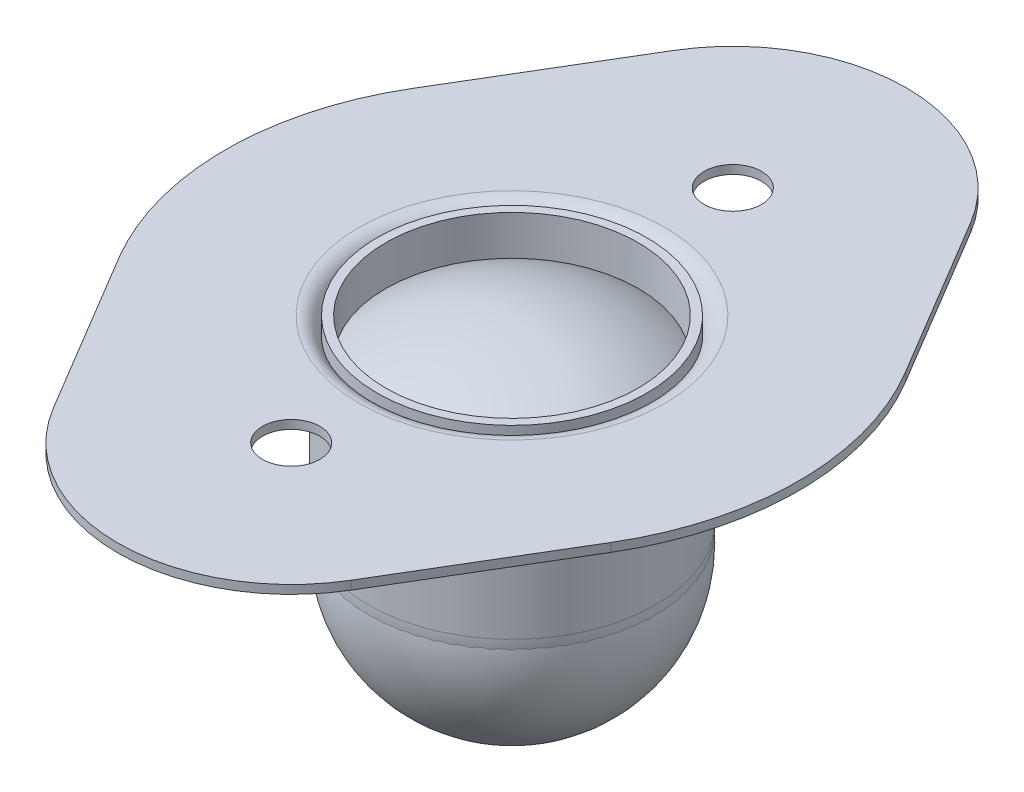
ISO-10303-21;
HEADER;
FILE_DESCRIPTION(('STEP AP214'),'2;1');
FILE_NAME('part.step','',(''),(''),'','','');
FILE_SCHEMA(('AUTOMOTIVE_DESIGN { 1 0 10303 214 1 1 1 1 }'));
ENDSEC;
DATA;
#1=APPLICATION_CONTEXT('core data for automotive mechanical design processes');
#2=APPLICATION_PROTOCOL_DEFINITION('international standard','automotive_design',2000,#1);
#3=PRODUCT_CONTEXT('',#1,'mechanical');
#4=PRODUCT('Part','Part','',(#3));
#5=PRODUCT_RELATED_PRODUCT_CATEGORY('part','',(#4));
#6=PRODUCT_DEFINITION_FORMATION('','',#4);
#7=PRODUCT_DEFINITION_CONTEXT('part definition',#1,'design');
#8=PRODUCT_DEFINITION('design','',#6,#7);
#9=PRODUCT_DEFINITION_SHAPE('','',#8);
#10=(LENGTH_UNIT() NAMED_UNIT(*) SI_UNIT(.MILLI.,.METRE.));
#11=(NAMED_UNIT(*) PLANE_ANGLE_UNIT() SI_UNIT($,.RADIAN.));
#12=(NAMED_UNIT(*) SI_UNIT($,.STERADIAN.) SOLID_ANGLE_UNIT());
#13=UNCERTAINTY_MEASURE_WITH_UNIT(LENGTH_MEASURE(1.E-05),#10,'distance_accuracy_value','');
#14=(GEOMETRIC_REPRESENTATION_CONTEXT(3) GLOBAL_UNCERTAINTY_ASSIGNED_CONTEXT((#13)) GLOBAL_UNIT_ASSIGNED_CONTEXT((#10,
#11,#12)) REPRESENTATION_CONTEXT('',''));
#15=CARTESIAN_POINT('',(0.,0.,0.));
#16=DIRECTION('',(0.,0.,1.));
#17=DIRECTION('',(1.,0.,0.));
#18=AXIS2_PLACEMENT_3D('',#15,#16,#17);
#19=CARTESIAN_POINT('',(0.,-16.7005,0.));
#20=DIRECTION('',(0.,-1.,0.));
#21=DIRECTION('',(0.,0.,1.));
#22=AXIS2_PLACEMENT_3D('',#19,#20,#21);
#23=SPHERICAL_SURFACE('',#22,12.7);
#24=CARTESIAN_POINT('',(0.,-29.4005,0.));
#25=VERTEX_POINT('',#24);
#26=VERTEX_LOOP('',#25);
#27=FACE_BOUND('',#26,.T.);
#28=ADVANCED_FACE('F40',(#27),#23,.T.);
#29=CLOSED_SHELL('',(#28));
#30=MANIFOLD_SOLID_BREP('B2',#29);
#31=CARTESIAN_POINT('',(0.,-11.938,0.));
#32=DIRECTION('',(0.,1.,0.));
#33=DIRECTION('',(0.,0.,1.));
#34=AXIS2_PLACEMENT_3D('',#31,#32,#33);
#35=CYLINDRICAL_SURFACE('',#34,11.938);
#36=CARTESIAN_POINT('',(0.,0.762,0.));
#37=DIRECTION('',(0.,1.,0.));
#38=DIRECTION('',(0.,0.,1.));
#39=AXIS2_PLACEMENT_3D('',#36,#37,#38);
#40=CIRCLE('',#39,11.938);
#41=CARTESIAN_POINT('',(0.,0.762,11.938));
#42=VERTEX_POINT('',#41);
#43=EDGE_CURVE('E39',#42,#42,#40,.T.);
#44=ORIENTED_EDGE('',*,*,#43,.F.);
#45=EDGE_LOOP('',(#44));
#46=FACE_BOUND('',#45,.T.);
#47=CARTESIAN_POINT('',(0.,-4.2942942560671,0.));
#48=DIRECTION('',(0.,-1.,0.));
#49=DIRECTION('',(0.,0.,-1.));
#50=AXIS2_PLACEMENT_3D('',#47,#48,#49);
#51=CIRCLE('',#50,11.938);
#52=CARTESIAN_POINT('',(0.,-4.2942942560671,-11.938));
#53=VERTEX_POINT('',#52);
#54=EDGE_CURVE('E66',#53,#53,#51,.F.);
#55=ORIENTED_EDGE('',*,*,#54,.T.);
#56=EDGE_LOOP('',(#55));
#57=FACE_BOUND('',#56,.T.);
#58=ADVANCED_FACE('F63',(#46,#57),#35,.T.);
#59=CARTESIAN_POINT('',(0.,0.762,0.));
#60=DIRECTION('',(0.,1.,0.));
#61=DIRECTION('',(0.,0.,1.));
#62=AXIS2_PLACEMENT_3D('',#59,#60,#61);
#63=PLANE('',#62);
#64=CARTESIAN_POINT('',(0.,0.762000000000001,0.));
#65=DIRECTION('',(0.,1.,0.));
#66=DIRECTION('',(0.,0.,1.));
#67=AXIS2_PLACEMENT_3D('',#64,#65,#66);
#68=CIRCLE('',#67,11.176);
#69=CARTESIAN_POINT('',(0.,0.762000000000001,11.176));
#70=VERTEX_POINT('',#69);
#71=EDGE_CURVE('E73',#70,#70,#68,.T.);
#72=ORIENTED_EDGE('',*,*,#71,.F.);
#73=EDGE_LOOP('',(#72));
#74=FACE_BOUND('',#73,.T.);
#75=ORIENTED_EDGE('',*,*,#43,.T.);
#76=EDGE_LOOP('',(#75));
#77=FACE_BOUND('',#76,.T.);
#78=ADVANCED_FACE('F93',(#74,#77),#63,.T.);
#79=CARTESIAN_POINT('',(0.,-18.7407752659574,0.));
#80=DIRECTION('',(0.,-1.,0.));
#81=DIRECTION('',(0.,0.,1.));
#82=AXIS2_PLACEMENT_3D('',#79,#80,#81);
#83=SPHERICAL_SURFACE('',#82,18.7407752659574);
#84=ORIENTED_EDGE('',*,*,#54,.F.);
#85=EDGE_LOOP('',(#84));
#86=FACE_BOUND('',#85,.T.);
#87=ADVANCED_FACE('F85',(#86),#83,.F.);
#88=CARTESIAN_POINT('',(0.,-11.938,0.));
#89=DIRECTION('',(0.,1.,0.));
#90=DIRECTION('',(0.,0.,1.));
#91=AXIS2_PLACEMENT_3D('',#88,#89,#90);
#92=CYLINDRICAL_SURFACE('',#91,11.176);
#93=ORIENTED_EDGE('',*,*,#71,.T.);
#94=EDGE_LOOP('',(#93));
#95=FACE_BOUND('',#94,.T.);
#96=CARTESIAN_POINT('',(0.,-2.75780723513033,0.));
#97=DIRECTION('',(0.,-1.,0.));
#98=DIRECTION('',(0.,0.,-1.));
#99=AXIS2_PLACEMENT_3D('',#96,#97,#98);
#100=CIRCLE('',#99,11.176);
#101=CARTESIAN_POINT('',(0.,-2.75780723513033,-11.176));
#102=VERTEX_POINT('',#101);
#103=EDGE_CURVE('E77',#102,#102,#100,.F.);
#104=ORIENTED_EDGE('',*,*,#103,.F.);
#105=EDGE_LOOP('',(#104));
#106=FACE_BOUND('',#105,.T.);
#107=ADVANCED_FACE('F83',(#95,#106),#92,.F.);
#108=CARTESIAN_POINT('',(0.,-18.7407752659574,0.));
#109=DIRECTION('',(0.,-1.,0.));
#110=DIRECTION('',(0.,0.,1.));
#111=AXIS2_PLACEMENT_3D('',#108,#109,#110);
#112=SPHERICAL_SURFACE('',#111,19.5027752659574);
#113=ORIENTED_EDGE('',*,*,#103,.T.);
#114=EDGE_LOOP('',(#113));
#115=FACE_BOUND('',#114,.T.);
#116=ADVANCED_FACE('F81',(#115),#112,.T.);
#117=CLOSED_SHELL('',(#58,#78,#87,#107,#116));
#118=MANIFOLD_SOLID_BREP('B6',#117);
#119=CARTESIAN_POINT('',(0.,0.762,0.));
#120=DIRECTION('',(0.,1.,0.));
#121=DIRECTION('',(0.,0.,1.));
#122=AXIS2_PLACEMENT_3D('',#119,#120,#121);
#123=PLANE('',#122);
#124=CARTESIAN_POINT('',(0.,0.762,0.));
#125=DIRECTION('',(0.,1.,0.));
#126=DIRECTION('',(0.,0.,1.));
#127=AXIS2_PLACEMENT_3D('',#124,#125,#126);
#128=CIRCLE('',#127,13.5255);
#129=CARTESIAN_POINT('',(0.,0.762,13.5255));
#130=VERTEX_POINT('',#129);
#131=EDGE_CURVE('E144',#130,#130,#128,.F.);
#132=ORIENTED_EDGE('',*,*,#131,.T.);
#133=EDGE_LOOP('',(#132));
#134=FACE_BOUND('',#133,.T.);
#135=CARTESIAN_POINT('',(0.,0.762,-19.558));
#136=DIRECTION('',(0.,1.,0.));
#137=DIRECTION('',(0.,0.,1.));
#138=AXIS2_PLACEMENT_3D('',#135,#136,#137);
#139=CIRCLE('',#138,2.54);
#140=CARTESIAN_POINT('',(0.,0.762,-22.098));
#141=VERTEX_POINT('',#140);
#142=EDGE_CURVE('E237',#141,#141,#139,.T.);
#143=ORIENTED_EDGE('',*,*,#142,.F.);
#144=EDGE_LOOP('',(#143));
#145=FACE_BOUND('',#144,.T.);
#146=CARTESIAN_POINT('',(0.,0.762,0.));
#147=DIRECTION('',(0.,1.,0.));
#148=DIRECTION('',(0.,0.,1.));
#149=AXIS2_PLACEMENT_3D('',#146,#147,#148);
#150=CIRCLE('',#149,25.4);
#151=CARTESIAN_POINT('',(21.8032677458843,0.762,13.0298701298701));
#152=VERTEX_POINT('',#151);
#153=CARTESIAN_POINT('',(21.8032677458843,0.762,-13.0298701298701));
#154=VERTEX_POINT('',#153);
#155=EDGE_CURVE('E248',#152,#154,#150,.T.);
#156=ORIENTED_EDGE('',*,*,#155,.T.);
#157=DIRECTION('',(-0.512987012987013,0.,-0.8583963679482));
#158=VECTOR('',#157,1.);
#159=CARTESIAN_POINT('',(21.8032677458843,0.762,-13.0298701298701));
#160=LINE('',#159,#158);
#161=CARTESIAN_POINT('',(13.19097698626,0.762,-27.4410714285714));
#162=VERTEX_POINT('',#161);
#163=EDGE_CURVE('E196',#154,#162,#160,.T.);
#164=ORIENTED_EDGE('',*,*,#163,.T.);
#165=CARTESIAN_POINT('',(0.,0.762,-19.558));
#166=DIRECTION('',(0.,1.,0.));
#167=DIRECTION('',(0.,0.,1.));
#168=AXIS2_PLACEMENT_3D('',#165,#166,#167);
#169=CIRCLE('',#168,15.367);
#170=CARTESIAN_POINT('',(-13.19097698626,0.762,-27.4410714285714));
#171=VERTEX_POINT('',#170);
#172=EDGE_CURVE('E368',#162,#171,#169,.T.);
#173=ORIENTED_EDGE('',*,*,#172,.T.);
#174=DIRECTION('',(-0.512987012987012,0.,0.858396367948201));
#175=VECTOR('',#174,1.);
#176=CARTESIAN_POINT('',(-13.19097698626,0.762,-27.4410714285714));
#177=LINE('',#176,#175);
#178=CARTESIAN_POINT('',(-21.8032677458843,0.762,-13.0298701298701));
#179=VERTEX_POINT('',#178);
#180=EDGE_CURVE('E370',#171,#179,#177,.T.);
#181=ORIENTED_EDGE('',*,*,#180,.T.);
#182=CARTESIAN_POINT('',(0.,0.762,0.));
#183=DIRECTION('',(0.,1.,0.));
#184=DIRECTION('',(0.,0.,1.));
#185=AXIS2_PLACEMENT_3D('',#182,#183,#184);
#186=CIRCLE('',#185,25.4);
#187=CARTESIAN_POINT('',(-21.8032677458843,0.762,13.0298701298701));
#188=VERTEX_POINT('',#187);
#189=EDGE_CURVE('E215',#179,#188,#186,.T.);
#190=ORIENTED_EDGE('',*,*,#189,.T.);
#191=DIRECTION('',(0.512987012987013,0.,0.8583963679482));
#192=VECTOR('',#191,1.);
#193=CARTESIAN_POINT('',(-13.19097698626,0.762,27.4410714285714));
#194=LINE('',#193,#192);
#195=CARTESIAN_POINT('',(-13.19097698626,0.762,27.4410714285714));
#196=VERTEX_POINT('',#195);
#197=EDGE_CURVE('E209',#188,#196,#194,.T.);
#198=ORIENTED_EDGE('',*,*,#197,.T.);
#199=CARTESIAN_POINT('',(0.,0.762,19.558));
#200=DIRECTION('',(0.,1.,0.));
#201=DIRECTION('',(0.,0.,1.));
#202=AXIS2_PLACEMENT_3D('',#199,#200,#201);
#203=CIRCLE('',#202,15.367);
#204=CARTESIAN_POINT('',(13.19097698626,0.762,27.4410714285714));
#205=VERTEX_POINT('',#204);
#206=EDGE_CURVE('E213',#196,#205,#203,.T.);
#207=ORIENTED_EDGE('',*,*,#206,.T.);
#208=DIRECTION('',(0.512987012987013,0.,-0.8583963679482));
#209=VECTOR('',#208,1.);
#210=CARTESIAN_POINT('',(21.8032677458843,0.762,13.0298701298701));
#211=LINE('',#210,#209);
#212=EDGE_CURVE('E152',#205,#152,#211,.T.);
#213=ORIENTED_EDGE('',*,*,#212,.T.);
#214=EDGE_LOOP('',(#156,#164,#173,#181,#190,#198,#207,#213));
#215=FACE_BOUND('',#214,.T.);
#216=CARTESIAN_POINT('',(0.,0.762,19.558));
#217=DIRECTION('',(0.,1.,0.));
#218=DIRECTION('',(0.,0.,1.));
#219=AXIS2_PLACEMENT_3D('',#216,#217,#218);
#220=CIRCLE('',#219,2.54);
#221=CARTESIAN_POINT('',(0.,0.762,17.018));
#222=VERTEX_POINT('',#221);
#223=EDGE_CURVE('E356',#222,#222,#220,.T.);
#224=ORIENTED_EDGE('',*,*,#223,.F.);
#225=EDGE_LOOP('',(#224));
#226=FACE_BOUND('',#225,.T.);
#227=ADVANCED_FACE('F135',(#134,#145,#215,#226),#123,.T.);
#228=CARTESIAN_POINT('',(0.,0.,0.));
#229=DIRECTION('',(0.,1.,0.));
#230=DIRECTION('',(0.,0.,1.));
#231=AXIS2_PLACEMENT_3D('',#228,#229,#230);
#232=PLANE('',#231);
#233=CARTESIAN_POINT('',(0.,0.,0.));
#234=DIRECTION('',(0.,1.,0.));
#235=DIRECTION('',(0.,0.,1.));
#236=AXIS2_PLACEMENT_3D('',#233,#234,#235);
#237=CIRCLE('',#236,14.2875);
#238=CARTESIAN_POINT('',(0.,0.,14.2875));
#239=VERTEX_POINT('',#238);
#240=EDGE_CURVE('E269',#239,#239,#237,.T.);
#241=ORIENTED_EDGE('',*,*,#240,.T.);
#242=EDGE_LOOP('',(#241));
#243=FACE_BOUND('',#242,.T.);
#244=CARTESIAN_POINT('',(0.,0.,0.));
#245=DIRECTION('',(0.,1.,0.));
#246=DIRECTION('',(0.,0.,1.));
#247=AXIS2_PLACEMENT_3D('',#244,#245,#246);
#248=CIRCLE('',#247,25.4);
#249=CARTESIAN_POINT('',(21.8032677458843,0.,13.0298701298701));
#250=VERTEX_POINT('',#249);
#251=CARTESIAN_POINT('',(21.8032677458843,0.,-13.0298701298701));
#252=VERTEX_POINT('',#251);
#253=EDGE_CURVE('E233',#250,#252,#248,.T.);
#254=ORIENTED_EDGE('',*,*,#253,.F.);
#255=DIRECTION('',(0.512987012987013,0.,-0.8583963679482));
#256=VECTOR('',#255,1.);
#257=CARTESIAN_POINT('',(21.8032677458843,0.,13.0298701298701));
#258=LINE('',#257,#256);
#259=CARTESIAN_POINT('',(13.19097698626,0.,27.4410714285714));
#260=VERTEX_POINT('',#259);
#261=EDGE_CURVE('E187',#260,#250,#258,.T.);
#262=ORIENTED_EDGE('',*,*,#261,.F.);
#263=CARTESIAN_POINT('',(0.,0.,19.558));
#264=DIRECTION('',(0.,1.,0.));
#265=DIRECTION('',(0.,0.,1.));
#266=AXIS2_PLACEMENT_3D('',#263,#264,#265);
#267=CIRCLE('',#266,15.367);
#268=CARTESIAN_POINT('',(-13.19097698626,0.,27.4410714285714));
#269=VERTEX_POINT('',#268);
#270=EDGE_CURVE('E181',#269,#260,#267,.T.);
#271=ORIENTED_EDGE('',*,*,#270,.F.);
#272=DIRECTION('',(0.512987012987013,0.,0.8583963679482));
#273=VECTOR('',#272,1.);
#274=CARTESIAN_POINT('',(-13.19097698626,0.,27.4410714285714));
#275=LINE('',#274,#273);
#276=CARTESIAN_POINT('',(-21.8032677458843,0.,13.0298701298701));
#277=VERTEX_POINT('',#276);
#278=EDGE_CURVE('E223',#277,#269,#275,.T.);
#279=ORIENTED_EDGE('',*,*,#278,.F.);
#280=CARTESIAN_POINT('',(0.,0.,0.));
#281=DIRECTION('',(0.,1.,0.));
#282=DIRECTION('',(0.,0.,1.));
#283=AXIS2_PLACEMENT_3D('',#280,#281,#282);
#284=CIRCLE('',#283,25.4);
#285=CARTESIAN_POINT('',(-21.8032677458843,0.,-13.0298701298701));
#286=VERTEX_POINT('',#285);
#287=EDGE_CURVE('E243',#286,#277,#284,.T.);
#288=ORIENTED_EDGE('',*,*,#287,.F.);
#289=DIRECTION('',(-0.512987012987012,0.,0.858396367948201));
#290=VECTOR('',#289,1.);
#291=CARTESIAN_POINT('',(-13.19097698626,0.,-27.4410714285714));
#292=LINE('',#291,#290);
#293=CARTESIAN_POINT('',(-13.19097698626,0.,-27.4410714285714));
#294=VERTEX_POINT('',#293);
#295=EDGE_CURVE('E241',#294,#286,#292,.T.);
#296=ORIENTED_EDGE('',*,*,#295,.F.);
#297=CARTESIAN_POINT('',(0.,0.,-19.558));
#298=DIRECTION('',(0.,1.,0.));
#299=DIRECTION('',(0.,0.,1.));
#300=AXIS2_PLACEMENT_3D('',#297,#298,#299);
#301=CIRCLE('',#300,15.367);
#302=CARTESIAN_POINT('',(13.19097698626,0.,-27.4410714285714));
#303=VERTEX_POINT('',#302);
#304=EDGE_CURVE('E239',#303,#294,#301,.T.);
#305=ORIENTED_EDGE('',*,*,#304,.F.);
#306=DIRECTION('',(-0.512987012987013,0.,-0.8583963679482));
#307=VECTOR('',#306,1.);
#308=CARTESIAN_POINT('',(21.8032677458843,0.,-13.0298701298701));
#309=LINE('',#308,#307);
#310=EDGE_CURVE('E236',#252,#303,#309,.T.);
#311=ORIENTED_EDGE('',*,*,#310,.F.);
#312=EDGE_LOOP('',(#254,#262,#271,#279,#288,#296,#305,#311));
#313=FACE_BOUND('',#312,.T.);
#314=CARTESIAN_POINT('',(0.,0.,-19.558));
#315=DIRECTION('',(0.,1.,0.));
#316=DIRECTION('',(0.,0.,1.));
#317=AXIS2_PLACEMENT_3D('',#314,#315,#316);
#318=CIRCLE('',#317,2.54);
#319=CARTESIAN_POINT('',(0.,0.,-22.098));
#320=VERTEX_POINT('',#319);
#321=EDGE_CURVE('E359',#320,#320,#318,.T.);
#322=ORIENTED_EDGE('',*,*,#321,.T.);
#323=EDGE_LOOP('',(#322));
#324=FACE_BOUND('',#323,.T.);
#325=CARTESIAN_POINT('',(0.,0.,19.558));
#326=DIRECTION('',(0.,1.,0.));
#327=DIRECTION('',(0.,0.,1.));
#328=AXIS2_PLACEMENT_3D('',#325,#326,#327);
#329=CIRCLE('',#328,2.54);
#330=CARTESIAN_POINT('',(0.,0.,17.018));
#331=VERTEX_POINT('',#330);
#332=EDGE_CURVE('E355',#331,#331,#329,.T.);
#333=ORIENTED_EDGE('',*,*,#332,.T.);
#334=EDGE_LOOP('',(#333));
#335=FACE_BOUND('',#334,.T.);
#336=ADVANCED_FACE('F290',(#243,#313,#324,#335),#232,.F.);
#337=CARTESIAN_POINT('',(0.,0.762,0.));
#338=DIRECTION('',(0.,-1.,0.));
#339=DIRECTION('',(0.,0.,-1.));
#340=AXIS2_PLACEMENT_3D('',#337,#338,#339);
#341=CYLINDRICAL_SURFACE('',#340,25.4);
#342=ORIENTED_EDGE('',*,*,#253,.T.);
#343=DIRECTION('',(0.,-1.,0.));
#344=VECTOR('',#343,1.);
#345=CARTESIAN_POINT('',(21.8032677458843,0.762,-13.0298701298701));
#346=LINE('',#345,#344);
#347=EDGE_CURVE('E261',#154,#252,#346,.T.);
#348=ORIENTED_EDGE('',*,*,#347,.F.);
#349=ORIENTED_EDGE('',*,*,#155,.F.);
#350=DIRECTION('',(0.,-1.,0.));
#351=VECTOR('',#350,1.);
#352=CARTESIAN_POINT('',(21.8032677458843,0.762,13.0298701298701));
#353=LINE('',#352,#351);
#354=EDGE_CURVE('E229',#152,#250,#353,.T.);
#355=ORIENTED_EDGE('',*,*,#354,.T.);
#356=EDGE_LOOP('',(#342,#348,#349,#355));
#357=FACE_BOUND('',#356,.T.);
#358=ADVANCED_FACE('F295',(#357),#341,.T.);
#359=CARTESIAN_POINT('',(21.8032677458843,0.762,-13.0298701298701));
#360=DIRECTION('',(-0.8583963679482,0.,0.512987012987013));
#361=DIRECTION('',(0.512987012987013,0.,0.8583963679482));
#362=AXIS2_PLACEMENT_3D('',#359,#360,#361);
#363=PLANE('',#362);
#364=ORIENTED_EDGE('',*,*,#310,.T.);
#365=DIRECTION('',(0.,-1.,0.));
#366=VECTOR('',#365,1.);
#367=CARTESIAN_POINT('',(13.19097698626,0.762,-27.4410714285714));
#368=LINE('',#367,#366);
#369=EDGE_CURVE('E258',#162,#303,#368,.T.);
#370=ORIENTED_EDGE('',*,*,#369,.F.);
#371=ORIENTED_EDGE('',*,*,#163,.F.);
#372=ORIENTED_EDGE('',*,*,#347,.T.);
#373=EDGE_LOOP('',(#364,#370,#371,#372));
#374=FACE_BOUND('',#373,.T.);
#375=ADVANCED_FACE('F320',(#374),#363,.F.);
#376=CARTESIAN_POINT('',(0.,0.762,-19.558));
#377=DIRECTION('',(0.,-1.,0.));
#378=DIRECTION('',(0.,0.,-1.));
#379=AXIS2_PLACEMENT_3D('',#376,#377,#378);
#380=CYLINDRICAL_SURFACE('',#379,15.367);
#381=ORIENTED_EDGE('',*,*,#304,.T.);
#382=DIRECTION('',(0.,-1.,0.));
#383=VECTOR('',#382,1.);
#384=CARTESIAN_POINT('',(-13.19097698626,0.762,-27.4410714285714));
#385=LINE('',#384,#383);
#386=EDGE_CURVE('E255',#171,#294,#385,.T.);
#387=ORIENTED_EDGE('',*,*,#386,.F.);
#388=ORIENTED_EDGE('',*,*,#172,.F.);
#389=ORIENTED_EDGE('',*,*,#369,.T.);
#390=EDGE_LOOP('',(#381,#387,#388,#389));
#391=FACE_BOUND('',#390,.T.);
#392=ADVANCED_FACE('F316',(#391),#380,.T.);
#393=CARTESIAN_POINT('',(-13.19097698626,0.762,-27.4410714285714));
#394=DIRECTION('',(0.858396367948201,0.,0.512987012987013));
#395=DIRECTION('',(0.512987012987013,0.,-0.858396367948201));
#396=AXIS2_PLACEMENT_3D('',#393,#394,#395);
#397=PLANE('',#396);
#398=ORIENTED_EDGE('',*,*,#295,.T.);
#399=DIRECTION('',(0.,-1.,0.));
#400=VECTOR('',#399,1.);
#401=CARTESIAN_POINT('',(-21.8032677458843,0.762,-13.0298701298701));
#402=LINE('',#401,#400);
#403=EDGE_CURVE('E252',#179,#286,#402,.T.);
#404=ORIENTED_EDGE('',*,*,#403,.F.);
#405=ORIENTED_EDGE('',*,*,#180,.F.);
#406=ORIENTED_EDGE('',*,*,#386,.T.);
#407=EDGE_LOOP('',(#398,#404,#405,#406));
#408=FACE_BOUND('',#407,.T.);
#409=ADVANCED_FACE('F312',(#408),#397,.F.);
#410=CARTESIAN_POINT('',(0.,0.762,0.));
#411=DIRECTION('',(0.,-1.,0.));
#412=DIRECTION('',(0.,0.,-1.));
#413=AXIS2_PLACEMENT_3D('',#410,#411,#412);
#414=CYLINDRICAL_SURFACE('',#413,25.4);
#415=ORIENTED_EDGE('',*,*,#287,.T.);
#416=DIRECTION('',(0.,-1.,0.));
#417=VECTOR('',#416,1.);
#418=CARTESIAN_POINT('',(-21.8032677458843,0.762,13.0298701298701));
#419=LINE('',#418,#417);
#420=EDGE_CURVE('E224',#188,#277,#419,.T.);
#421=ORIENTED_EDGE('',*,*,#420,.F.);
#422=ORIENTED_EDGE('',*,*,#189,.F.);
#423=ORIENTED_EDGE('',*,*,#403,.T.);
#424=EDGE_LOOP('',(#415,#421,#422,#423));
#425=FACE_BOUND('',#424,.T.);
#426=ADVANCED_FACE('F309',(#425),#414,.T.);
#427=CARTESIAN_POINT('',(-13.19097698626,0.762,27.4410714285714));
#428=DIRECTION('',(0.8583963679482,0.,-0.512987012987013));
#429=DIRECTION('',(-0.512987012987013,0.,-0.858396367948201));
#430=AXIS2_PLACEMENT_3D('',#427,#428,#429);
#431=PLANE('',#430);
#432=ORIENTED_EDGE('',*,*,#278,.T.);
#433=DIRECTION('',(0.,-1.,0.));
#434=VECTOR('',#433,1.);
#435=CARTESIAN_POINT('',(-13.19097698626,0.762,27.4410714285714));
#436=LINE('',#435,#434);
#437=EDGE_CURVE('E220',#196,#269,#436,.T.);
#438=ORIENTED_EDGE('',*,*,#437,.F.);
#439=ORIENTED_EDGE('',*,*,#197,.F.);
#440=ORIENTED_EDGE('',*,*,#420,.T.);
#441=EDGE_LOOP('',(#432,#438,#439,#440));
#442=FACE_BOUND('',#441,.T.);
#443=ADVANCED_FACE('F221',(#442),#431,.F.);
#444=CARTESIAN_POINT('',(0.,0.762,19.558));
#445=DIRECTION('',(0.,-1.,0.));
#446=DIRECTION('',(0.,0.,-1.));
#447=AXIS2_PLACEMENT_3D('',#444,#445,#446);
#448=CYLINDRICAL_SURFACE('',#447,15.367);
#449=ORIENTED_EDGE('',*,*,#270,.T.);
#450=DIRECTION('',(0.,-1.,0.));
#451=VECTOR('',#450,1.);
#452=CARTESIAN_POINT('',(13.19097698626,0.762,27.4410714285714));
#453=LINE('',#452,#451);
#454=EDGE_CURVE('E225',#205,#260,#453,.T.);
#455=ORIENTED_EDGE('',*,*,#454,.F.);
#456=ORIENTED_EDGE('',*,*,#206,.F.);
#457=ORIENTED_EDGE('',*,*,#437,.T.);
#458=EDGE_LOOP('',(#449,#455,#456,#457));
#459=FACE_BOUND('',#458,.T.);
#460=ADVANCED_FACE('F227',(#459),#448,.T.);
#461=CARTESIAN_POINT('',(21.8032677458843,0.762,13.0298701298701));
#462=DIRECTION('',(-0.8583963679482,0.,-0.512987012987013));
#463=DIRECTION('',(-0.512987012987013,0.,0.858396367948201));
#464=AXIS2_PLACEMENT_3D('',#461,#462,#463);
#465=PLANE('',#464);
#466=ORIENTED_EDGE('',*,*,#261,.T.);
#467=ORIENTED_EDGE('',*,*,#354,.F.);
#468=ORIENTED_EDGE('',*,*,#212,.F.);
#469=ORIENTED_EDGE('',*,*,#454,.T.);
#470=EDGE_LOOP('',(#466,#467,#468,#469));
#471=FACE_BOUND('',#470,.T.);
#472=ADVANCED_FACE('F302',(#471),#465,.F.);
#473=CARTESIAN_POINT('',(0.,0.762,-19.558));
#474=DIRECTION('',(0.,-1.,0.));
#475=DIRECTION('',(0.,0.,-1.));
#476=AXIS2_PLACEMENT_3D('',#473,#474,#475);
#477=CYLINDRICAL_SURFACE('',#476,2.54);
#478=CARTESIAN_POINT('',(0.,0.762,-22.098));
#479=CARTESIAN_POINT('',(0.,0.7540625,-22.098));
#480=CARTESIAN_POINT('',(0.,0.746125,-22.098));
#481=CARTESIAN_POINT('',(0.,0.73025,-22.098));
#482=CARTESIAN_POINT('',(0.,0.7223125,-22.098));
#483=CARTESIAN_POINT('',(0.,0.7064375,-22.098));
#484=CARTESIAN_POINT('',(0.,0.6985,-22.098));
#485=CARTESIAN_POINT('',(0.,0.682625,-22.098));
#486=CARTESIAN_POINT('',(0.,0.6746875,-22.098));
#487=CARTESIAN_POINT('',(0.,0.6588125,-22.098));
#488=CARTESIAN_POINT('',(0.,0.650875,-22.098));
#489=CARTESIAN_POINT('',(0.,0.635,-22.098));
#490=CARTESIAN_POINT('',(0.,0.6270625,-22.098));
#491=CARTESIAN_POINT('',(0.,0.6111875,-22.098));
#492=CARTESIAN_POINT('',(0.,0.60325,-22.098));
#493=CARTESIAN_POINT('',(0.,0.587375,-22.098));
#494=CARTESIAN_POINT('',(0.,0.5794375,-22.098));
#495=CARTESIAN_POINT('',(0.,0.5635625,-22.098));
#496=CARTESIAN_POINT('',(0.,0.555625,-22.098));
#497=CARTESIAN_POINT('',(0.,0.53975,-22.098));
#498=CARTESIAN_POINT('',(0.,0.5318125,-22.098));
#499=CARTESIAN_POINT('',(0.,0.5159375,-22.098));
#500=CARTESIAN_POINT('',(0.,0.508,-22.098));
#501=CARTESIAN_POINT('',(0.,0.492125,-22.098));
#502=CARTESIAN_POINT('',(0.,0.4841875,-22.098));
#503=CARTESIAN_POINT('',(0.,0.4683125,-22.098));
#504=CARTESIAN_POINT('',(0.,0.460375,-22.098));
#505=CARTESIAN_POINT('',(0.,0.4445,-22.098));
#506=CARTESIAN_POINT('',(0.,0.4365625,-22.098));
#507=CARTESIAN_POINT('',(0.,0.4206875,-22.098));
#508=CARTESIAN_POINT('',(0.,0.41275,-22.098));
#509=CARTESIAN_POINT('',(0.,0.396875,-22.098));
#510=CARTESIAN_POINT('',(0.,0.3889375,-22.098));
#511=CARTESIAN_POINT('',(0.,0.3730625,-22.098));
#512=CARTESIAN_POINT('',(0.,0.365125,-22.098));
#513=CARTESIAN_POINT('',(0.,0.34925,-22.098));
#514=CARTESIAN_POINT('',(0.,0.3413125,-22.098));
#515=CARTESIAN_POINT('',(0.,0.3254375,-22.098));
#516=CARTESIAN_POINT('',(0.,0.3175,-22.098));
#517=CARTESIAN_POINT('',(0.,0.301625,-22.098));
#518=CARTESIAN_POINT('',(0.,0.2936875,-22.098));
#519=CARTESIAN_POINT('',(0.,0.2778125,-22.098));
#520=CARTESIAN_POINT('',(0.,0.269875,-22.098));
#521=CARTESIAN_POINT('',(0.,0.254,-22.098));
#522=CARTESIAN_POINT('',(0.,0.2460625,-22.098));
#523=CARTESIAN_POINT('',(0.,0.2301875,-22.098));
#524=CARTESIAN_POINT('',(0.,0.22225,-22.098));
#525=CARTESIAN_POINT('',(0.,0.206375,-22.098));
#526=CARTESIAN_POINT('',(0.,0.1984375,-22.098));
#527=CARTESIAN_POINT('',(0.,0.1825625,-22.098));
#528=CARTESIAN_POINT('',(0.,0.174625,-22.098));
#529=CARTESIAN_POINT('',(0.,0.15875,-22.098));
#530=CARTESIAN_POINT('',(0.,0.1508125,-22.098));
#531=CARTESIAN_POINT('',(0.,0.1349375,-22.098));
#532=CARTESIAN_POINT('',(0.,0.127,-22.098));
#533=CARTESIAN_POINT('',(0.,0.111125,-22.098));
#534=CARTESIAN_POINT('',(0.,0.1031875,-22.098));
#535=CARTESIAN_POINT('',(0.,0.0873125,-22.098));
#536=CARTESIAN_POINT('',(0.,0.079375,-22.098));
#537=CARTESIAN_POINT('',(0.,0.0635,-22.098));
#538=CARTESIAN_POINT('',(0.,0.0555625,-22.098));
#539=CARTESIAN_POINT('',(0.,0.0396875,-22.098));
#540=CARTESIAN_POINT('',(0.,0.03175,-22.098));
#541=CARTESIAN_POINT('',(0.,0.015875,-22.098));
#542=CARTESIAN_POINT('',(0.,0.00793749999999999,-22.098));
#543=CARTESIAN_POINT('',(0.,0.,-22.098));
#544=B_SPLINE_CURVE_WITH_KNOTS('',3,(#478,#479,#480,#481,#482,#483,#484,#485,#486,#487,#488,
#489,#490,#491,#492,#493,#494,#495,#496,#497,#498,#499,#500,#501,#502,#503,#504,#505,#506,#507,
#508,#509,#510,#511,#512,#513,#514,#515,#516,#517,#518,#519,#520,#521,#522,#523,#524,#525,#526,
#527,#528,#529,#530,#531,#532,#533,#534,#535,#536,#537,#538,#539,#540,#541,#542,#543),
.UNSPECIFIED.,.F.,.F.,(4,2,2,2,2,2,2,2,2,2,2,2,2,2,2,2,2,2,2,2,2,2,2,2,2,2,2,2,2,2,2,2,4),(0.,
0.0238125000000001,0.047625,0.0714375,0.0952500000000001,0.1190625,0.142875,0.1666875,0.1905,
0.2143125,0.238125,0.2619375,0.28575,0.3095625,0.333375,0.3571875,0.381,0.4048125,0.428625,
0.4524375,0.47625,0.5000625,0.523875,0.5476875,0.5715,0.5953125,0.619125,0.6429375,0.66675,
0.6905625,0.714375,0.7381875,0.762),.UNSPECIFIED.);
#545=EDGE_CURVE('BSEAM299',#141,#320,#544,.T.);
#546=ORIENTED_EDGE('',*,*,#142,.T.);
#547=ORIENTED_EDGE('',*,*,#321,.F.);
#548=ORIENTED_EDGE('',*,*,#545,.T.);
#549=ORIENTED_EDGE('',*,*,#545,.F.);
#550=EDGE_LOOP('',(#546,#548,#547,#549));
#551=FACE_BOUND('',#550,.T.);
#552=ADVANCED_FACE('F299',(#551),#477,.F.);
#553=CARTESIAN_POINT('',(0.,0.762,19.558));
#554=DIRECTION('',(0.,-1.,0.));
#555=DIRECTION('',(0.,0.,-1.));
#556=AXIS2_PLACEMENT_3D('',#553,#554,#555);
#557=CYLINDRICAL_SURFACE('',#556,2.54);
#558=CARTESIAN_POINT('',(0.,0.762,17.018));
#559=CARTESIAN_POINT('',(0.,0.7540625,17.018));
#560=CARTESIAN_POINT('',(0.,0.746125,17.018));
#561=CARTESIAN_POINT('',(0.,0.73025,17.018));
#562=CARTESIAN_POINT('',(0.,0.7223125,17.018));
#563=CARTESIAN_POINT('',(0.,0.7064375,17.018));
#564=CARTESIAN_POINT('',(0.,0.6985,17.018));
#565=CARTESIAN_POINT('',(0.,0.682625,17.018));
#566=CARTESIAN_POINT('',(0.,0.6746875,17.018));
#567=CARTESIAN_POINT('',(0.,0.6588125,17.018));
#568=CARTESIAN_POINT('',(0.,0.650875,17.018));
#569=CARTESIAN_POINT('',(0.,0.635,17.018));
#570=CARTESIAN_POINT('',(0.,0.6270625,17.018));
#571=CARTESIAN_POINT('',(0.,0.6111875,17.018));
#572=CARTESIAN_POINT('',(0.,0.60325,17.018));
#573=CARTESIAN_POINT('',(0.,0.587375,17.018));
#574=CARTESIAN_POINT('',(0.,0.5794375,17.018));
#575=CARTESIAN_POINT('',(0.,0.5635625,17.018));
#576=CARTESIAN_POINT('',(0.,0.555625,17.018));
#577=CARTESIAN_POINT('',(0.,0.53975,17.018));
#578=CARTESIAN_POINT('',(0.,0.5318125,17.018));
#579=CARTESIAN_POINT('',(0.,0.5159375,17.018));
#580=CARTESIAN_POINT('',(0.,0.508,17.018));
#581=CARTESIAN_POINT('',(0.,0.492125,17.018));
#582=CARTESIAN_POINT('',(0.,0.4841875,17.018));
#583=CARTESIAN_POINT('',(0.,0.4683125,17.018));
#584=CARTESIAN_POINT('',(0.,0.460375,17.018));
#585=CARTESIAN_POINT('',(0.,0.4445,17.018));
#586=CARTESIAN_POINT('',(0.,0.4365625,17.018));
#587=CARTESIAN_POINT('',(0.,0.4206875,17.018));
#588=CARTESIAN_POINT('',(0.,0.41275,17.018));
#589=CARTESIAN_POINT('',(0.,0.396875,17.018));
#590=CARTESIAN_POINT('',(0.,0.3889375,17.018));
#591=CARTESIAN_POINT('',(0.,0.3730625,17.018));
#592=CARTESIAN_POINT('',(0.,0.365125,17.018));
#593=CARTESIAN_POINT('',(0.,0.34925,17.018));
#594=CARTESIAN_POINT('',(0.,0.3413125,17.018));
#595=CARTESIAN_POINT('',(0.,0.3254375,17.018));
#596=CARTESIAN_POINT('',(0.,0.3175,17.018));
#597=CARTESIAN_POINT('',(0.,0.301625,17.018));
#598=CARTESIAN_POINT('',(0.,0.2936875,17.018));
#599=CARTESIAN_POINT('',(0.,0.2778125,17.018));
#600=CARTESIAN_POINT('',(0.,0.269875,17.018));
#601=CARTESIAN_POINT('',(0.,0.254,17.018));
#602=CARTESIAN_POINT('',(0.,0.2460625,17.018));
#603=CARTESIAN_POINT('',(0.,0.2301875,17.018));
#604=CARTESIAN_POINT('',(0.,0.22225,17.018));
#605=CARTESIAN_POINT('',(0.,0.206375,17.018));
#606=CARTESIAN_POINT('',(0.,0.1984375,17.018));
#607=CARTESIAN_POINT('',(0.,0.1825625,17.018));
#608=CARTESIAN_POINT('',(0.,0.174625,17.018));
#609=CARTESIAN_POINT('',(0.,0.15875,17.018));
#610=CARTESIAN_POINT('',(0.,0.1508125,17.018));
#611=CARTESIAN_POINT('',(0.,0.1349375,17.018));
#612=CARTESIAN_POINT('',(0.,0.127,17.018));
#613=CARTESIAN_POINT('',(0.,0.111125,17.018));
#614=CARTESIAN_POINT('',(0.,0.1031875,17.018));
#615=CARTESIAN_POINT('',(0.,0.0873125,17.018));
#616=CARTESIAN_POINT('',(0.,0.079375,17.018));
#617=CARTESIAN_POINT('',(0.,0.0635,17.018));
#618=CARTESIAN_POINT('',(0.,0.0555625,17.018));
#619=CARTESIAN_POINT('',(0.,0.0396875,17.018));
#620=CARTESIAN_POINT('',(0.,0.03175,17.018));
#621=CARTESIAN_POINT('',(0.,0.015875,17.018));
#622=CARTESIAN_POINT('',(0.,0.00793749999999999,17.018));
#623=CARTESIAN_POINT('',(0.,0.,17.018));
#624=B_SPLINE_CURVE_WITH_KNOTS('',3,(#558,#559,#560,#561,#562,#563,#564,#565,#566,#567,#568,
#569,#570,#571,#572,#573,#574,#575,#576,#577,#578,#579,#580,#581,#582,#583,#584,#585,#586,#587,
#588,#589,#590,#591,#592,#593,#594,#595,#596,#597,#598,#599,#600,#601,#602,#603,#604,#605,#606,
#607,#608,#609,#610,#611,#612,#613,#614,#615,#616,#617,#618,#619,#620,#621,#622,#623),
.UNSPECIFIED.,.F.,.F.,(4,2,2,2,2,2,2,2,2,2,2,2,2,2,2,2,2,2,2,2,2,2,2,2,2,2,2,2,2,2,2,2,4),(0.,
0.0238125000000001,0.047625,0.0714375,0.0952500000000001,0.1190625,0.142875,0.1666875,0.1905,
0.2143125,0.238125,0.2619375,0.28575,0.3095625,0.333375,0.3571875,0.381,0.4048125,0.428625,
0.4524375,0.47625,0.5000625,0.523875,0.5476875,0.5715,0.5953125,0.619125,0.6429375,0.66675,
0.6905625,0.714375,0.7381875,0.762),.UNSPECIFIED.);
#625=EDGE_CURVE('BSEAM338',#222,#331,#624,.T.);
#626=ORIENTED_EDGE('',*,*,#223,.T.);
#627=ORIENTED_EDGE('',*,*,#332,.F.);
#628=ORIENTED_EDGE('',*,*,#625,.T.);
#629=ORIENTED_EDGE('',*,*,#625,.F.);
#630=EDGE_LOOP('',(#626,#628,#627,#629));
#631=FACE_BOUND('',#630,.T.);
#632=ADVANCED_FACE('F338',(#631),#557,.F.);
#633=CARTESIAN_POINT('',(0.,-84.3715244842766,0.));
#634=DIRECTION('',(0.,1.,0.));
#635=DIRECTION('',(0.,0.,1.));
#636=AXIS2_PLACEMENT_3D('',#633,#634,#635);
#637=CYLINDRICAL_SURFACE('',#636,12.7);
#638=CARTESIAN_POINT('',(0.,-1.58750000000001,0.));
#639=DIRECTION('',(0.,1.,0.));
#640=DIRECTION('',(0.,0.,1.));
#641=AXIS2_PLACEMENT_3D('',#638,#639,#640);
#642=CIRCLE('',#641,12.7);
#643=CARTESIAN_POINT('',(0.,-1.58750000000002,12.7));
#644=VERTEX_POINT('',#643);
#645=EDGE_CURVE('E266',#644,#644,#642,.F.);
#646=CARTESIAN_POINT('',(0.,-15.1129999999999,0.));
#647=DIRECTION('',(0.,1.,0.));
#648=DIRECTION('',(0.,0.,1.));
#649=AXIS2_PLACEMENT_3D('',#646,#647,#648);
#650=CIRCLE('',#649,12.7);
#651=CARTESIAN_POINT('',(0.,-15.113,12.7));
#652=VERTEX_POINT('',#651);
#653=EDGE_CURVE('E263',#652,#652,#650,.T.);
#654=CARTESIAN_POINT('',(0.,-1.58750000000002,12.7));
#655=CARTESIAN_POINT('',(0.,-1.72839062500002,12.7));
#656=CARTESIAN_POINT('',(0.,-1.86928125000002,12.7));
#657=CARTESIAN_POINT('',(0.,-2.15106250000002,12.7));
#658=CARTESIAN_POINT('',(0.,-2.29195312500001,12.7));
#659=CARTESIAN_POINT('',(0.,-2.57373437500001,12.7));
#660=CARTESIAN_POINT('',(0.,-2.71462500000001,12.7));
#661=CARTESIAN_POINT('',(0.,-2.99640625000001,12.7));
#662=CARTESIAN_POINT('',(0.,-3.13729687500001,12.7));
#663=CARTESIAN_POINT('',(0.,-3.41907812500001,12.7));
#664=CARTESIAN_POINT('',(0.,-3.55996875000001,12.7));
#665=CARTESIAN_POINT('',(0.,-3.84175,12.7));
#666=CARTESIAN_POINT('',(0.,-3.98264062500001,12.7));
#667=CARTESIAN_POINT('',(0.,-4.26442187500001,12.7));
#668=CARTESIAN_POINT('',(0.,-4.40531250000001,12.7));
#669=CARTESIAN_POINT('',(0.,-4.68709375000001,12.7));
#670=CARTESIAN_POINT('',(0.,-4.82798437500001,12.7));
#671=CARTESIAN_POINT('',(0.,-5.10976562500001,12.7));
#672=CARTESIAN_POINT('',(0.,-5.25065625,12.7));
#673=CARTESIAN_POINT('',(0.,-5.5324375,12.7));
#674=CARTESIAN_POINT('',(0.,-5.673328125,12.7));
#675=CARTESIAN_POINT('',(0.,-5.955109375,12.7));
#676=CARTESIAN_POINT('',(0.,-6.096,12.7));
#677=CARTESIAN_POINT('',(0.,-6.37778125,12.7));
#678=CARTESIAN_POINT('',(0.,-6.518671875,12.7));
#679=CARTESIAN_POINT('',(0.,-6.80045312499999,12.7));
#680=CARTESIAN_POINT('',(0.,-6.94134375,12.7));
#681=CARTESIAN_POINT('',(0.,-7.223125,12.7));
#682=CARTESIAN_POINT('',(0.,-7.364015625,12.7));
#683=CARTESIAN_POINT('',(0.,-7.64579687499999,12.7));
#684=CARTESIAN_POINT('',(0.,-7.78668749999999,12.7));
#685=CARTESIAN_POINT('',(0.,-8.06846874999999,12.7));
#686=CARTESIAN_POINT('',(0.,-8.20935937499999,12.7));
#687=CARTESIAN_POINT('',(0.,-8.49114062499999,12.7));
#688=CARTESIAN_POINT('',(0.,-8.63203124999999,12.7));
#689=CARTESIAN_POINT('',(0.,-8.91381249999999,12.7));
#690=CARTESIAN_POINT('',(0.,-9.05470312499999,12.7));
#691=CARTESIAN_POINT('',(0.,-9.33648437499998,12.7));
#692=CARTESIAN_POINT('',(0.,-9.47737499999998,12.7));
#693=CARTESIAN_POINT('',(0.,-9.75915624999998,12.7));
#694=CARTESIAN_POINT('',(0.,-9.90004687499999,12.7));
#695=CARTESIAN_POINT('',(0.,-10.181828125,12.7));
#696=CARTESIAN_POINT('',(0.,-10.32271875,12.7));
#697=CARTESIAN_POINT('',(0.,-10.6045,12.7));
#698=CARTESIAN_POINT('',(0.,-10.745390625,12.7));
#699=CARTESIAN_POINT('',(0.,-11.027171875,12.7));
#700=CARTESIAN_POINT('',(0.,-11.1680625,12.7));
#701=CARTESIAN_POINT('',(0.,-11.44984375,12.7));
#702=CARTESIAN_POINT('',(0.,-11.590734375,12.7));
#703=CARTESIAN_POINT('',(0.,-11.872515625,12.7));
#704=CARTESIAN_POINT('',(0.,-12.01340625,12.7));
#705=CARTESIAN_POINT('',(0.,-12.2951875,12.7));
#706=CARTESIAN_POINT('',(0.,-12.436078125,12.7));
#707=CARTESIAN_POINT('',(0.,-12.717859375,12.7));
#708=CARTESIAN_POINT('',(0.,-12.85875,12.7));
#709=CARTESIAN_POINT('',(0.,-13.14053125,12.7));
#710=CARTESIAN_POINT('',(0.,-13.281421875,12.7));
#711=CARTESIAN_POINT('',(0.,-13.563203125,12.7));
#712=CARTESIAN_POINT('',(0.,-13.70409375,12.7));
#713=CARTESIAN_POINT('',(0.,-13.985875,12.7));
#714=CARTESIAN_POINT('',(0.,-14.126765625,12.7));
#715=CARTESIAN_POINT('',(0.,-14.408546875,12.7));
#716=CARTESIAN_POINT('',(0.,-14.5494375,12.7));
#717=CARTESIAN_POINT('',(0.,-14.83121875,12.7));
#718=CARTESIAN_POINT('',(0.,-14.972109375,12.7));
#719=CARTESIAN_POINT('',(0.,-15.113,12.7));
#720=B_SPLINE_CURVE_WITH_KNOTS('',3,(#654,#655,#656,#657,#658,#659,#660,#661,#662,#663,#664,
#665,#666,#667,#668,#669,#670,#671,#672,#673,#674,#675,#676,#677,#678,#679,#680,#681,#682,#683,
#684,#685,#686,#687,#688,#689,#690,#691,#692,#693,#694,#695,#696,#697,#698,#699,#700,#701,#702,
#703,#704,#705,#706,#707,#708,#709,#710,#711,#712,#713,#714,#715,#716,#717,#718,#719),
.UNSPECIFIED.,.F.,.F.,(4,2,2,2,2,2,2,2,2,2,2,2,2,2,2,2,2,2,2,2,2,2,2,2,2,2,2,2,2,2,2,2,4),(0.,
0.422671875000002,0.845343749999991,1.26801562499999,1.6906875,2.11335937499998,
2.53603124999999,2.95870312499999,3.38137499999999,3.80404687499998,4.22671874999998,
4.64939062499999,5.07206249999997,5.49473437499998,5.91740624999998,6.34007812499997,
6.76274999999997,7.18542187499997,7.60809374999996,8.03076562499996,8.45343749999997,
8.87610937499997,9.29878124999996,9.72145312499996,10.1441249999999,10.566796875,10.98946875,
11.412140625,11.8348124999999,12.2574843749999,12.6801562499999,13.1028281249999,
13.5254999999999),.UNSPECIFIED.);
#721=EDGE_CURVE('BSEAM330',#644,#652,#720,.T.);
#722=ORIENTED_EDGE('',*,*,#645,.T.);
#723=ORIENTED_EDGE('',*,*,#653,.T.);
#724=ORIENTED_EDGE('',*,*,#721,.T.);
#725=ORIENTED_EDGE('',*,*,#721,.F.);
#726=EDGE_LOOP('',(#722,#724,#723,#725));
#727=FACE_BOUND('',#726,.T.);
#728=ADVANCED_FACE('F330',(#727),#637,.T.);
#729=CARTESIAN_POINT('',(0.,-15.113,0.));
#730=DIRECTION('',(0.,1.,0.));
#731=DIRECTION('',(0.,0.,1.));
#732=AXIS2_PLACEMENT_3D('',#729,#730,#731);
#733=DEGENERATE_TOROIDAL_SURFACE('',#732,3.96875,8.73125,.T.);
#734=CARTESIAN_POINT('',(0.,-23.84425,0.));
#735=DIRECTION('',(0.,-1.,0.));
#736=DIRECTION('',(0.,0.,-1.));
#737=AXIS2_PLACEMENT_3D('',#734,#735,#736);
#738=CIRCLE('',#737,3.96875);
#739=CARTESIAN_POINT('',(0.,-23.84425,-3.96875));
#740=VERTEX_POINT('',#739);
#741=EDGE_CURVE('E344',#740,#740,#738,.T.);
#742=ORIENTED_EDGE('',*,*,#741,.F.);
#743=EDGE_LOOP('',(#742));
#744=FACE_BOUND('',#743,.T.);
#745=ORIENTED_EDGE('',*,*,#653,.F.);
#746=EDGE_LOOP('',(#745));
#747=FACE_BOUND('',#746,.T.);
#748=ADVANCED_FACE('F327',(#744,#747),#733,.T.);
#749=CARTESIAN_POINT('',(0.,-84.3715244842766,0.));
#750=DIRECTION('',(0.,1.,0.));
#751=DIRECTION('',(0.,0.,1.));
#752=AXIS2_PLACEMENT_3D('',#749,#750,#751);
#753=CYLINDRICAL_SURFACE('',#752,11.938);
#754=CARTESIAN_POINT('',(0.,-0.825500000000007,0.));
#755=DIRECTION('',(0.,1.,0.));
#756=DIRECTION('',(0.,0.,1.));
#757=AXIS2_PLACEMENT_3D('',#754,#755,#756);
#758=CIRCLE('',#757,11.938);
#759=CARTESIAN_POINT('',(0.,-0.825500000000007,11.938));
#760=VERTEX_POINT('',#759);
#761=EDGE_CURVE('E61',#760,#760,#758,.T.);
#762=CARTESIAN_POINT('',(0.,-15.113,0.));
#763=DIRECTION('',(0.,1.,0.));
#764=DIRECTION('',(0.,0.,1.));
#765=AXIS2_PLACEMENT_3D('',#762,#763,#764);
#766=CIRCLE('',#765,11.938);
#767=CARTESIAN_POINT('',(0.,-15.113,11.938));
#768=VERTEX_POINT('',#767);
#769=EDGE_CURVE('E350',#768,#768,#766,.T.);
#770=CARTESIAN_POINT('',(0.,-0.825500000000007,11.938));
#771=CARTESIAN_POINT('',(0.,-0.974328125000007,11.938));
#772=CARTESIAN_POINT('',(0.,-1.12315625000001,11.938));
#773=CARTESIAN_POINT('',(0.,-1.42081250000001,11.938));
#774=CARTESIAN_POINT('',(0.,-1.56964062500001,11.938));
#775=CARTESIAN_POINT('',(0.,-1.86729687500001,11.938));
#776=CARTESIAN_POINT('',(0.,-2.01612500000001,11.938));
#777=CARTESIAN_POINT('',(0.,-2.31378125000001,11.938));
#778=CARTESIAN_POINT('',(0.,-2.46260937500001,11.938));
#779=CARTESIAN_POINT('',(0.,-2.76026562500001,11.938));
#780=CARTESIAN_POINT('',(0.,-2.90909375000001,11.938));
#781=CARTESIAN_POINT('',(0.,-3.20675000000001,11.938));
#782=CARTESIAN_POINT('',(0.,-3.35557812500001,11.938));
#783=CARTESIAN_POINT('',(0.,-3.65323437500001,11.938));
#784=CARTESIAN_POINT('',(0.,-3.80206250000001,11.938));
#785=CARTESIAN_POINT('',(0.,-4.09971875000001,11.938));
#786=CARTESIAN_POINT('',(0.,-4.24854687500001,11.938));
#787=CARTESIAN_POINT('',(0.,-4.546203125,11.938));
#788=CARTESIAN_POINT('',(0.,-4.69503125,11.938));
#789=CARTESIAN_POINT('',(0.,-4.9926875,11.938));
#790=CARTESIAN_POINT('',(0.,-5.141515625,11.938));
#791=CARTESIAN_POINT('',(0.,-5.439171875,11.938));
#792=CARTESIAN_POINT('',(0.,-5.588,11.938));
#793=CARTESIAN_POINT('',(0.,-5.88565625,11.938));
#794=CARTESIAN_POINT('',(0.,-6.034484375,11.938));
#795=CARTESIAN_POINT('',(0.,-6.332140625,11.938));
#796=CARTESIAN_POINT('',(0.,-6.48096875,11.938));
#797=CARTESIAN_POINT('',(0.,-6.778625,11.938));
#798=CARTESIAN_POINT('',(0.,-6.927453125,11.938));
#799=CARTESIAN_POINT('',(0.,-7.225109375,11.938));
#800=CARTESIAN_POINT('',(0.,-7.3739375,11.938));
#801=CARTESIAN_POINT('',(0.,-7.67159375,11.938));
#802=CARTESIAN_POINT('',(0.,-7.820421875,11.938));
#803=CARTESIAN_POINT('',(0.,-8.118078125,11.938));
#804=CARTESIAN_POINT('',(0.,-8.26690625,11.938));
#805=CARTESIAN_POINT('',(0.,-8.5645625,11.938));
#806=CARTESIAN_POINT('',(0.,-8.713390625,11.938));
#807=CARTESIAN_POINT('',(0.,-9.011046875,11.938));
#808=CARTESIAN_POINT('',(0.,-9.159875,11.938));
#809=CARTESIAN_POINT('',(0.,-9.45753125,11.938));
#810=CARTESIAN_POINT('',(0.,-9.606359375,11.938));
#811=CARTESIAN_POINT('',(0.,-9.904015625,11.938));
#812=CARTESIAN_POINT('',(0.,-10.05284375,11.938));
#813=CARTESIAN_POINT('',(0.,-10.3505,11.938));
#814=CARTESIAN_POINT('',(0.,-10.499328125,11.938));
#815=CARTESIAN_POINT('',(0.,-10.796984375,11.938));
#816=CARTESIAN_POINT('',(0.,-10.9458125,11.938));
#817=CARTESIAN_POINT('',(0.,-11.24346875,11.938));
#818=CARTESIAN_POINT('',(0.,-11.392296875,11.938));
#819=CARTESIAN_POINT('',(0.,-11.689953125,11.938));
#820=CARTESIAN_POINT('',(0.,-11.83878125,11.938));
#821=CARTESIAN_POINT('',(0.,-12.1364375,11.938));
#822=CARTESIAN_POINT('',(0.,-12.285265625,11.938));
#823=CARTESIAN_POINT('',(0.,-12.582921875,11.938));
#824=CARTESIAN_POINT('',(0.,-12.73175,11.938));
#825=CARTESIAN_POINT('',(0.,-13.02940625,11.938));
#826=CARTESIAN_POINT('',(0.,-13.178234375,11.938));
#827=CARTESIAN_POINT('',(0.,-13.475890625,11.938));
#828=CARTESIAN_POINT('',(0.,-13.62471875,11.938));
#829=CARTESIAN_POINT('',(0.,-13.922375,11.938));
#830=CARTESIAN_POINT('',(0.,-14.071203125,11.938));
#831=CARTESIAN_POINT('',(0.,-14.368859375,11.938));
#832=CARTESIAN_POINT('',(0.,-14.5176875,11.938));
#833=CARTESIAN_POINT('',(0.,-14.81534375,11.938));
#834=CARTESIAN_POINT('',(0.,-14.964171875,11.938));
#835=CARTESIAN_POINT('',(0.,-15.113,11.938));
#836=B_SPLINE_CURVE_WITH_KNOTS('',3,(#770,#771,#772,#773,#774,#775,#776,#777,#778,#779,#780,
#781,#782,#783,#784,#785,#786,#787,#788,#789,#790,#791,#792,#793,#794,#795,#796,#797,#798,#799,
#800,#801,#802,#803,#804,#805,#806,#807,#808,#809,#810,#811,#812,#813,#814,#815,#816,#817,#818,
#819,#820,#821,#822,#823,#824,#825,#826,#827,#828,#829,#830,#831,#832,#833,#834,#835),
.UNSPECIFIED.,.F.,.F.,(4,2,2,2,2,2,2,2,2,2,2,2,2,2,2,2,2,2,2,2,2,2,2,2,2,2,2,2,2,2,2,2,4),(0.,
0.446484375,0.892968750000001,1.339453125,1.7859375,2.232421875,2.67890625,3.125390625,3.571875,
4.01835937499999,4.46484374999999,4.91132812499999,5.35781249999999,5.80429687499999,
6.25078124999999,6.69726562499999,7.14374999999999,7.59023437499999,8.03671874999999,
8.48320312499999,8.92968749999999,9.37617187499999,9.82265624999999,10.269140625,10.715625,
11.162109375,11.60859375,12.055078125,12.5015625,12.948046875,13.39453125,13.841015625,14.2875),.UNSPECIFIED.);
#837=EDGE_CURVE('BSEAM329',#760,#768,#836,.T.);
#838=ORIENTED_EDGE('',*,*,#761,.T.);
#839=ORIENTED_EDGE('',*,*,#769,.F.);
#840=ORIENTED_EDGE('',*,*,#837,.T.);
#841=ORIENTED_EDGE('',*,*,#837,.F.);
#842=EDGE_LOOP('',(#838,#840,#839,#841));
#843=FACE_BOUND('',#842,.T.);
#844=ADVANCED_FACE('F329',(#843),#753,.F.);
#845=CARTESIAN_POINT('',(0.,-15.113,0.));
#846=DIRECTION('',(0.,1.,0.));
#847=DIRECTION('',(0.,0.,1.));
#848=AXIS2_PLACEMENT_3D('',#845,#846,#847);
#849=DEGENERATE_TOROIDAL_SURFACE('',#848,3.96875,7.96925,.T.);
#850=CARTESIAN_POINT('',(0.,-23.08225,0.));
#851=DIRECTION('',(0.,1.,0.));
#852=DIRECTION('',(0.,0.,1.));
#853=AXIS2_PLACEMENT_3D('',#850,#851,#852);
#854=CIRCLE('',#853,3.96875);
#855=CARTESIAN_POINT('',(0.,-23.08225,3.96875));
#856=VERTEX_POINT('',#855);
#857=EDGE_CURVE('E347',#856,#856,#854,.F.);
#858=ORIENTED_EDGE('',*,*,#857,.T.);
#859=EDGE_LOOP('',(#858));
#860=FACE_BOUND('',#859,.T.);
#861=ORIENTED_EDGE('',*,*,#769,.T.);
#862=EDGE_LOOP('',(#861));
#863=FACE_BOUND('',#862,.T.);
#864=ADVANCED_FACE('F286',(#860,#863),#849,.F.);
#865=CARTESIAN_POINT('',(0.,-1.58750000000001,0.));
#866=DIRECTION('',(0.,1.,0.));
#867=DIRECTION('',(0.,0.,1.));
#868=AXIS2_PLACEMENT_3D('',#865,#866,#867);
#869=TOROIDAL_SURFACE('',#868,14.2875,1.5875);
#870=ORIENTED_EDGE('',*,*,#240,.F.);
#871=EDGE_LOOP('',(#870));
#872=FACE_BOUND('',#871,.T.);
#873=ORIENTED_EDGE('',*,*,#645,.F.);
#874=EDGE_LOOP('',(#873));
#875=FACE_BOUND('',#874,.T.);
#876=ADVANCED_FACE('F278',(#872,#875),#869,.F.);
#877=CARTESIAN_POINT('',(0.,-0.825500000000007,0.));
#878=DIRECTION('',(0.,1.,0.));
#879=DIRECTION('',(0.,0.,1.));
#880=AXIS2_PLACEMENT_3D('',#877,#878,#879);
#881=TOROIDAL_SURFACE('',#880,13.5255,1.5875);
#882=ORIENTED_EDGE('',*,*,#761,.F.);
#883=EDGE_LOOP('',(#882));
#884=FACE_BOUND('',#883,.T.);
#885=ORIENTED_EDGE('',*,*,#131,.F.);
#886=EDGE_LOOP('',(#885));
#887=FACE_BOUND('',#886,.T.);
#888=ADVANCED_FACE('F137',(#884,#887),#881,.T.);
#889=CARTESIAN_POINT('',(0.,-11.8569298486636,0.));
#890=DIRECTION('',(0.,-1.,0.));
#891=DIRECTION('',(0.,0.,-1.));
#892=AXIS2_PLACEMENT_3D('',#889,#890,#891);
#893=CYLINDRICAL_SURFACE('',#892,3.96875);
#894=ORIENTED_EDGE('',*,*,#741,.T.);
#895=EDGE_LOOP('',(#894));
#896=FACE_BOUND('',#895,.T.);
#897=ORIENTED_EDGE('',*,*,#857,.F.);
#898=EDGE_LOOP('',(#897));
#899=FACE_BOUND('',#898,.T.);
#900=ADVANCED_FACE('F277',(#896,#899),#893,.F.);
#901=CLOSED_SHELL('',(#227,#336,#358,#375,#392,#409,#426,#443,#460,#472,#552,#632,#728,#748,
#844,#864,#876,#888,#900));
#902=MANIFOLD_SOLID_BREP('B34',#901);
#903=ADVANCED_BREP_SHAPE_REPRESENTATION('',(#18,#30,#118,#902),#14);
#904=SHAPE_DEFINITION_REPRESENTATION(#9,#903);
ENDSEC;
END-ISO-10303-21;
